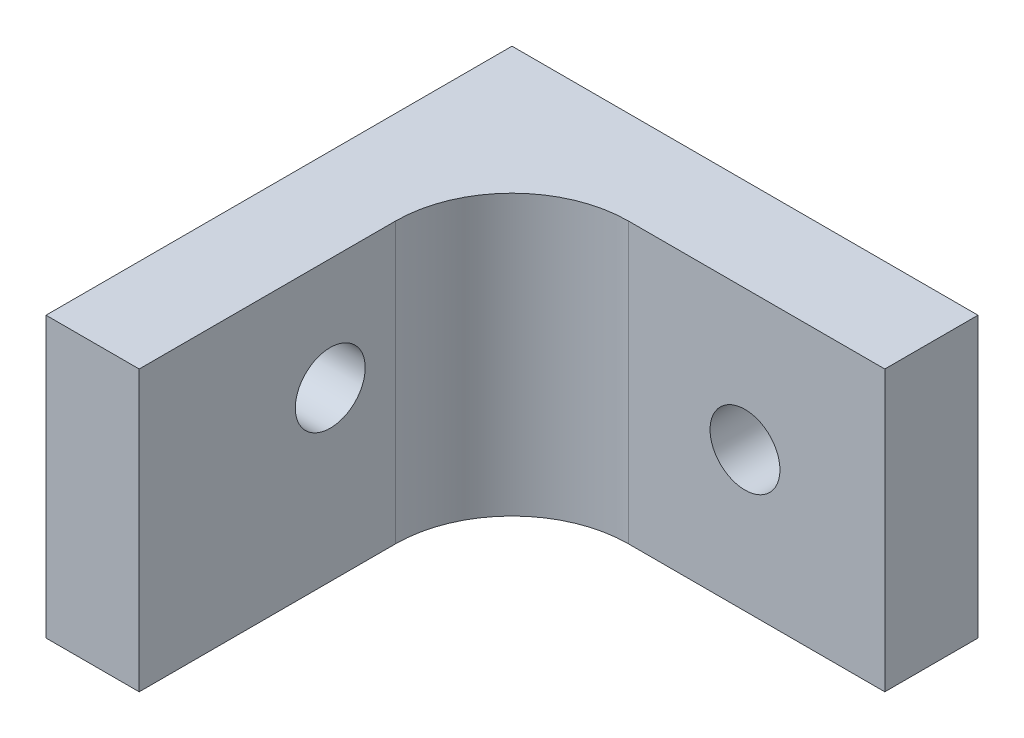
ISO-10303-21;
HEADER;
FILE_DESCRIPTION(('STEP AP214'),'2;1');
FILE_NAME('part.step','',(''),(''),'','','');
FILE_SCHEMA(('AUTOMOTIVE_DESIGN { 1 0 10303 214 1 1 1 1 }'));
ENDSEC;
DATA;
#1=APPLICATION_CONTEXT('core data for automotive mechanical design processes');
#2=APPLICATION_PROTOCOL_DEFINITION('international standard','automotive_design',2000,#1);
#3=PRODUCT_CONTEXT('',#1,'mechanical');
#4=PRODUCT('Part','Part','',(#3));
#5=PRODUCT_RELATED_PRODUCT_CATEGORY('part','',(#4));
#6=PRODUCT_DEFINITION_FORMATION('','',#4);
#7=PRODUCT_DEFINITION_CONTEXT('part definition',#1,'design');
#8=PRODUCT_DEFINITION('design','',#6,#7);
#9=PRODUCT_DEFINITION_SHAPE('','',#8);
#10=(LENGTH_UNIT() NAMED_UNIT(*) SI_UNIT(.MILLI.,.METRE.));
#11=(NAMED_UNIT(*) PLANE_ANGLE_UNIT() SI_UNIT($,.RADIAN.));
#12=(NAMED_UNIT(*) SI_UNIT($,.STERADIAN.) SOLID_ANGLE_UNIT());
#13=UNCERTAINTY_MEASURE_WITH_UNIT(LENGTH_MEASURE(1.E-05),#10,'distance_accuracy_value','');
#14=(GEOMETRIC_REPRESENTATION_CONTEXT(3) GLOBAL_UNCERTAINTY_ASSIGNED_CONTEXT((#13)) GLOBAL_UNIT_ASSIGNED_CONTEXT((#10,
#11,#12)) REPRESENTATION_CONTEXT('',''));
#15=CARTESIAN_POINT('',(0.,0.,0.));
#16=DIRECTION('',(0.,0.,1.));
#17=DIRECTION('',(1.,0.,0.));
#18=AXIS2_PLACEMENT_3D('',#15,#16,#17);
#19=CARTESIAN_POINT('',(0.,0.,2.));
#20=DIRECTION('',(0.,0.,1.));
#21=DIRECTION('',(1.,0.,0.));
#22=AXIS2_PLACEMENT_3D('',#19,#20,#21);
#23=PLANE('',#22);
#24=CARTESIAN_POINT('',(-3.,-3.,2.));
#25=DIRECTION('',(0.,0.,1.));
#26=DIRECTION('',(1.,0.,0.));
#27=AXIS2_PLACEMENT_3D('',#24,#25,#26);
#28=CIRCLE('',#27,0.75);
#29=CARTESIAN_POINT('',(-2.25,-3.,2.));
#30=VERTEX_POINT('',#29);
#31=EDGE_CURVE('E124',#30,#30,#28,.T.);
#32=ORIENTED_EDGE('',*,*,#31,.F.);
#33=EDGE_LOOP('',(#32));
#34=FACE_BOUND('',#33,.T.);
#35=DIRECTION('',(-1.,0.,0.));
#36=VECTOR('',#35,1.);
#37=CARTESIAN_POINT('',(0.,0.,2.));
#38=LINE('',#37,#36);
#39=CARTESIAN_POINT('',(0.,0.,2.));
#40=VERTEX_POINT('',#39);
#41=CARTESIAN_POINT('',(-5.5,0.,2.));
#42=VERTEX_POINT('',#41);
#43=EDGE_CURVE('E131',#40,#42,#38,.T.);
#44=ORIENTED_EDGE('',*,*,#43,.T.);
#45=DIRECTION('',(0.,-1.,0.));
#46=VECTOR('',#45,1.);
#47=CARTESIAN_POINT('',(-5.5,0.,2.));
#48=LINE('',#47,#46);
#49=CARTESIAN_POINT('',(-5.5,-6.00000000000001,2.));
#50=VERTEX_POINT('',#49);
#51=EDGE_CURVE('E156',#42,#50,#48,.T.);
#52=ORIENTED_EDGE('',*,*,#51,.T.);
#53=DIRECTION('',(1.,0.,0.));
#54=VECTOR('',#53,1.);
#55=CARTESIAN_POINT('',(0.,-6.00000000000001,2.));
#56=LINE('',#55,#54);
#57=CARTESIAN_POINT('',(0.,-6.00000000000001,2.));
#58=VERTEX_POINT('',#57);
#59=EDGE_CURVE('E136',#50,#58,#56,.T.);
#60=ORIENTED_EDGE('',*,*,#59,.T.);
#61=DIRECTION('',(0.,1.,0.));
#62=VECTOR('',#61,1.);
#63=CARTESIAN_POINT('',(0.,-6.00000000000001,2.));
#64=LINE('',#63,#62);
#65=EDGE_CURVE('E126',#58,#40,#64,.T.);
#66=ORIENTED_EDGE('',*,*,#65,.T.);
#67=EDGE_LOOP('',(#44,#52,#60,#66));
#68=FACE_BOUND('',#67,.T.);
#69=ADVANCED_FACE('F39',(#34,#68),#23,.T.);
#70=CARTESIAN_POINT('',(0.,0.,0.));
#71=DIRECTION('',(0.,0.,1.));
#72=DIRECTION('',(1.,0.,0.));
#73=AXIS2_PLACEMENT_3D('',#70,#71,#72);
#74=PLANE('',#73);
#75=DIRECTION('',(0.,-1.,0.));
#76=VECTOR('',#75,1.);
#77=CARTESIAN_POINT('',(-10.,-6.00000000000001,0.));
#78=LINE('',#77,#76);
#79=CARTESIAN_POINT('',(-10.,0.,0.));
#80=VERTEX_POINT('',#79);
#81=CARTESIAN_POINT('',(-10.,-6.00000000000001,0.));
#82=VERTEX_POINT('',#81);
#83=EDGE_CURVE('E141',#80,#82,#78,.T.);
#84=ORIENTED_EDGE('',*,*,#83,.F.);
#85=DIRECTION('',(-1.,0.,0.));
#86=VECTOR('',#85,1.);
#87=CARTESIAN_POINT('',(0.,0.,0.));
#88=LINE('',#87,#86);
#89=CARTESIAN_POINT('',(0.,0.,0.));
#90=VERTEX_POINT('',#89);
#91=EDGE_CURVE('E142',#90,#80,#88,.T.);
#92=ORIENTED_EDGE('',*,*,#91,.F.);
#93=DIRECTION('',(0.,1.,0.));
#94=VECTOR('',#93,1.);
#95=CARTESIAN_POINT('',(0.,-6.00000000000001,0.));
#96=LINE('',#95,#94);
#97=CARTESIAN_POINT('',(0.,-6.00000000000001,0.));
#98=VERTEX_POINT('',#97);
#99=EDGE_CURVE('E127',#98,#90,#96,.T.);
#100=ORIENTED_EDGE('',*,*,#99,.F.);
#101=DIRECTION('',(1.,0.,0.));
#102=VECTOR('',#101,1.);
#103=CARTESIAN_POINT('',(0.,-6.00000000000001,0.));
#104=LINE('',#103,#102);
#105=EDGE_CURVE('E135',#82,#98,#104,.T.);
#106=ORIENTED_EDGE('',*,*,#105,.F.);
#107=EDGE_LOOP('',(#84,#92,#100,#106));
#108=FACE_BOUND('',#107,.T.);
#109=CARTESIAN_POINT('',(-3.,-3.,0.));
#110=DIRECTION('',(0.,0.,1.));
#111=DIRECTION('',(1.,0.,0.));
#112=AXIS2_PLACEMENT_3D('',#109,#110,#111);
#113=CIRCLE('',#112,0.75);
#114=CARTESIAN_POINT('',(-2.25,-3.,0.));
#115=VERTEX_POINT('',#114);
#116=EDGE_CURVE('E122',#115,#115,#113,.T.);
#117=ORIENTED_EDGE('',*,*,#116,.T.);
#118=EDGE_LOOP('',(#117));
#119=FACE_BOUND('',#118,.T.);
#120=ADVANCED_FACE('F181',(#108,#119),#74,.F.);
#121=CARTESIAN_POINT('',(0.,-6.00000000000001,2.));
#122=DIRECTION('',(-1.,0.,0.));
#123=DIRECTION('',(0.,-1.,0.));
#124=AXIS2_PLACEMENT_3D('',#121,#122,#123);
#125=PLANE('',#124);
#126=ORIENTED_EDGE('',*,*,#99,.T.);
#127=DIRECTION('',(0.,0.,-1.));
#128=VECTOR('',#127,1.);
#129=CARTESIAN_POINT('',(0.,0.,2.));
#130=LINE('',#129,#128);
#131=EDGE_CURVE('E155',#40,#90,#130,.T.);
#132=ORIENTED_EDGE('',*,*,#131,.F.);
#133=ORIENTED_EDGE('',*,*,#65,.F.);
#134=DIRECTION('',(0.,0.,-1.));
#135=VECTOR('',#134,1.);
#136=CARTESIAN_POINT('',(0.,-6.00000000000001,2.));
#137=LINE('',#136,#135);
#138=EDGE_CURVE('E137',#58,#98,#137,.T.);
#139=ORIENTED_EDGE('',*,*,#138,.T.);
#140=EDGE_LOOP('',(#126,#132,#133,#139));
#141=FACE_BOUND('',#140,.T.);
#142=ADVANCED_FACE('F169',(#141),#125,.F.);
#143=CARTESIAN_POINT('',(0.,0.,2.));
#144=DIRECTION('',(0.,-1.,0.));
#145=DIRECTION('',(0.,0.,-1.));
#146=AXIS2_PLACEMENT_3D('',#143,#144,#145);
#147=PLANE('',#146);
#148=DIRECTION('',(0.,0.,-1.));
#149=VECTOR('',#148,1.);
#150=CARTESIAN_POINT('',(-10.,0.,2.));
#151=LINE('',#150,#149);
#152=CARTESIAN_POINT('',(-10.,0.,10.));
#153=VERTEX_POINT('',#152);
#154=EDGE_CURVE('E148',#153,#80,#151,.T.);
#155=ORIENTED_EDGE('',*,*,#154,.F.);
#156=DIRECTION('',(-1.,0.,0.));
#157=VECTOR('',#156,1.);
#158=CARTESIAN_POINT('',(-8.,0.,10.));
#159=LINE('',#158,#157);
#160=CARTESIAN_POINT('',(-8.,0.,10.));
#161=VERTEX_POINT('',#160);
#162=EDGE_CURVE('E109',#161,#153,#159,.T.);
#163=ORIENTED_EDGE('',*,*,#162,.F.);
#164=DIRECTION('',(0.,0.,-1.));
#165=VECTOR('',#164,1.);
#166=CARTESIAN_POINT('',(-8.,0.,0.));
#167=LINE('',#166,#165);
#168=CARTESIAN_POINT('',(-8.,0.,4.5));
#169=VERTEX_POINT('',#168);
#170=EDGE_CURVE('E111',#161,#169,#167,.T.);
#171=ORIENTED_EDGE('',*,*,#170,.T.);
#172=CARTESIAN_POINT('',(-5.5,0.,4.5));
#173=DIRECTION('',(0.,-1.,0.));
#174=DIRECTION('',(0.,0.,-1.));
#175=AXIS2_PLACEMENT_3D('',#172,#173,#174);
#176=CIRCLE('',#175,2.5);
#177=EDGE_CURVE('E11',#169,#42,#176,.T.);
#178=ORIENTED_EDGE('',*,*,#177,.T.);
#179=ORIENTED_EDGE('',*,*,#43,.F.);
#180=ORIENTED_EDGE('',*,*,#131,.T.);
#181=ORIENTED_EDGE('',*,*,#91,.T.);
#182=EDGE_LOOP('',(#155,#163,#171,#178,#179,#180,#181));
#183=FACE_BOUND('',#182,.T.);
#184=ADVANCED_FACE('F171',(#183),#147,.F.);
#185=CARTESIAN_POINT('',(-10.,-6.00000000000001,2.));
#186=DIRECTION('',(1.,0.,0.));
#187=DIRECTION('',(0.,0.,-1.));
#188=AXIS2_PLACEMENT_3D('',#185,#186,#187);
#189=PLANE('',#188);
#190=ORIENTED_EDGE('',*,*,#83,.T.);
#191=DIRECTION('',(0.,0.,-1.));
#192=VECTOR('',#191,1.);
#193=CARTESIAN_POINT('',(-10.,-6.00000000000001,2.));
#194=LINE('',#193,#192);
#195=CARTESIAN_POINT('',(-10.,-6.,10.));
#196=VERTEX_POINT('',#195);
#197=EDGE_CURVE('E149',#196,#82,#194,.T.);
#198=ORIENTED_EDGE('',*,*,#197,.F.);
#199=DIRECTION('',(0.,1.,0.));
#200=VECTOR('',#199,1.);
#201=CARTESIAN_POINT('',(-10.,0.,10.));
#202=LINE('',#201,#200);
#203=EDGE_CURVE('E101',#196,#153,#202,.T.);
#204=ORIENTED_EDGE('',*,*,#203,.T.);
#205=ORIENTED_EDGE('',*,*,#154,.T.);
#206=EDGE_LOOP('',(#190,#198,#204,#205));
#207=FACE_BOUND('',#206,.T.);
#208=CARTESIAN_POINT('',(-10.,-2.4,5.90000000000007));
#209=DIRECTION('',(-1.,0.,0.));
#210=DIRECTION('',(0.,0.,1.));
#211=AXIS2_PLACEMENT_3D('',#208,#209,#210);
#212=CIRCLE('',#211,0.75);
#213=CARTESIAN_POINT('',(-10.,-2.4,6.65000000000007));
#214=VERTEX_POINT('',#213);
#215=EDGE_CURVE('E283',#214,#214,#212,.T.);
#216=ORIENTED_EDGE('',*,*,#215,.F.);
#217=EDGE_LOOP('',(#216));
#218=FACE_BOUND('',#217,.T.);
#219=ADVANCED_FACE('F196',(#207,#218),#189,.F.);
#220=CARTESIAN_POINT('',(0.,-6.00000000000001,2.));
#221=DIRECTION('',(0.,1.,0.));
#222=DIRECTION('',(0.,0.,1.));
#223=AXIS2_PLACEMENT_3D('',#220,#221,#222);
#224=PLANE('',#223);
#225=ORIENTED_EDGE('',*,*,#105,.T.);
#226=ORIENTED_EDGE('',*,*,#138,.F.);
#227=ORIENTED_EDGE('',*,*,#59,.F.);
#228=CARTESIAN_POINT('',(-5.5,-6.00000000000001,4.5));
#229=DIRECTION('',(0.,1.,0.));
#230=DIRECTION('',(0.,0.,1.));
#231=AXIS2_PLACEMENT_3D('',#228,#229,#230);
#232=CIRCLE('',#231,2.5);
#233=CARTESIAN_POINT('',(-8.,-6.,4.5));
#234=VERTEX_POINT('',#233);
#235=EDGE_CURVE('E50',#50,#234,#232,.T.);
#236=ORIENTED_EDGE('',*,*,#235,.T.);
#237=DIRECTION('',(0.,0.,1.));
#238=VECTOR('',#237,1.);
#239=CARTESIAN_POINT('',(-8.,-6.,0.));
#240=LINE('',#239,#238);
#241=CARTESIAN_POINT('',(-8.,-6.,10.));
#242=VERTEX_POINT('',#241);
#243=EDGE_CURVE('E94',#234,#242,#240,.T.);
#244=ORIENTED_EDGE('',*,*,#243,.T.);
#245=DIRECTION('',(-1.,0.,0.));
#246=VECTOR('',#245,1.);
#247=CARTESIAN_POINT('',(-8.,-6.,10.));
#248=LINE('',#247,#246);
#249=EDGE_CURVE('E100',#242,#196,#248,.T.);
#250=ORIENTED_EDGE('',*,*,#249,.T.);
#251=ORIENTED_EDGE('',*,*,#197,.T.);
#252=EDGE_LOOP('',(#225,#226,#227,#236,#244,#250,#251));
#253=FACE_BOUND('',#252,.T.);
#254=ADVANCED_FACE('F97',(#253),#224,.F.);
#255=CARTESIAN_POINT('',(-3.,-3.,2.));
#256=DIRECTION('',(0.,0.,-1.));
#257=DIRECTION('',(-1.,0.,0.));
#258=AXIS2_PLACEMENT_3D('',#255,#256,#257);
#259=CYLINDRICAL_SURFACE('',#258,0.75);
#260=ORIENTED_EDGE('',*,*,#31,.T.);
#261=EDGE_LOOP('',(#260));
#262=FACE_BOUND('',#261,.T.);
#263=ORIENTED_EDGE('',*,*,#116,.F.);
#264=EDGE_LOOP('',(#263));
#265=FACE_BOUND('',#264,.T.);
#266=ADVANCED_FACE('F195',(#262,#265),#259,.F.);
#267=CARTESIAN_POINT('',(-8.,0.,10.));
#268=DIRECTION('',(0.,0.,1.));
#269=DIRECTION('',(1.,0.,0.));
#270=AXIS2_PLACEMENT_3D('',#267,#268,#269);
#271=PLANE('',#270);
#272=ORIENTED_EDGE('',*,*,#203,.F.);
#273=ORIENTED_EDGE('',*,*,#249,.F.);
#274=DIRECTION('',(0.,1.,0.));
#275=VECTOR('',#274,1.);
#276=CARTESIAN_POINT('',(-8.,0.,10.));
#277=LINE('',#276,#275);
#278=EDGE_CURVE('E105',#242,#161,#277,.T.);
#279=ORIENTED_EDGE('',*,*,#278,.T.);
#280=ORIENTED_EDGE('',*,*,#162,.T.);
#281=EDGE_LOOP('',(#272,#273,#279,#280));
#282=FACE_BOUND('',#281,.T.);
#283=ADVANCED_FACE('F110',(#282),#271,.T.);
#284=CARTESIAN_POINT('',(-8.,0.,0.));
#285=DIRECTION('',(-1.,0.,0.));
#286=DIRECTION('',(0.,0.,1.));
#287=AXIS2_PLACEMENT_3D('',#284,#285,#286);
#288=PLANE('',#287);
#289=ORIENTED_EDGE('',*,*,#243,.F.);
#290=DIRECTION('',(0.,-1.,0.));
#291=VECTOR('',#290,1.);
#292=CARTESIAN_POINT('',(-8.,0.,4.5));
#293=LINE('',#292,#291);
#294=EDGE_CURVE('E58',#234,#169,#293,.F.);
#295=ORIENTED_EDGE('',*,*,#294,.T.);
#296=ORIENTED_EDGE('',*,*,#170,.F.);
#297=ORIENTED_EDGE('',*,*,#278,.F.);
#298=EDGE_LOOP('',(#289,#295,#296,#297));
#299=FACE_BOUND('',#298,.T.);
#300=CARTESIAN_POINT('',(-8.,-2.4,5.90000000000007));
#301=DIRECTION('',(-1.,0.,0.));
#302=DIRECTION('',(0.,0.,1.));
#303=AXIS2_PLACEMENT_3D('',#300,#301,#302);
#304=CIRCLE('',#303,0.75);
#305=CARTESIAN_POINT('',(-8.,-2.4,6.65000000000007));
#306=VERTEX_POINT('',#305);
#307=EDGE_CURVE('E119',#306,#306,#304,.T.);
#308=ORIENTED_EDGE('',*,*,#307,.T.);
#309=EDGE_LOOP('',(#308));
#310=FACE_BOUND('',#309,.T.);
#311=ADVANCED_FACE('F113',(#299,#310),#288,.F.);
#312=CARTESIAN_POINT('',(-8.,-2.4,5.90000000000007));
#313=DIRECTION('',(-1.,0.,0.));
#314=DIRECTION('',(0.,0.,1.));
#315=AXIS2_PLACEMENT_3D('',#312,#313,#314);
#316=CYLINDRICAL_SURFACE('',#315,0.75);
#317=ORIENTED_EDGE('',*,*,#307,.F.);
#318=EDGE_LOOP('',(#317));
#319=FACE_BOUND('',#318,.T.);
#320=ORIENTED_EDGE('',*,*,#215,.T.);
#321=EDGE_LOOP('',(#320));
#322=FACE_BOUND('',#321,.T.);
#323=ADVANCED_FACE('F173',(#319,#322),#316,.F.);
#324=CARTESIAN_POINT('',(-5.5,0.,4.5));
#325=DIRECTION('',(0.,-1.,0.));
#326=DIRECTION('',(0.,0.,-1.));
#327=AXIS2_PLACEMENT_3D('',#324,#325,#326);
#328=CYLINDRICAL_SURFACE('',#327,2.5);
#329=ORIENTED_EDGE('',*,*,#177,.F.);
#330=ORIENTED_EDGE('',*,*,#294,.F.);
#331=ORIENTED_EDGE('',*,*,#235,.F.);
#332=ORIENTED_EDGE('',*,*,#51,.F.);
#333=EDGE_LOOP('',(#329,#330,#331,#332));
#334=FACE_BOUND('',#333,.T.);
#335=ADVANCED_FACE('F41',(#334),#328,.F.);
#336=CLOSED_SHELL('',(#69,#120,#142,#184,#219,#254,#266,#283,#311,#323,#335));
#337=MANIFOLD_SOLID_BREP('B2',#336);
#338=ADVANCED_BREP_SHAPE_REPRESENTATION('',(#18,#337),#14);
#339=SHAPE_DEFINITION_REPRESENTATION(#9,#338);
ENDSEC;
END-ISO-10303-21;
